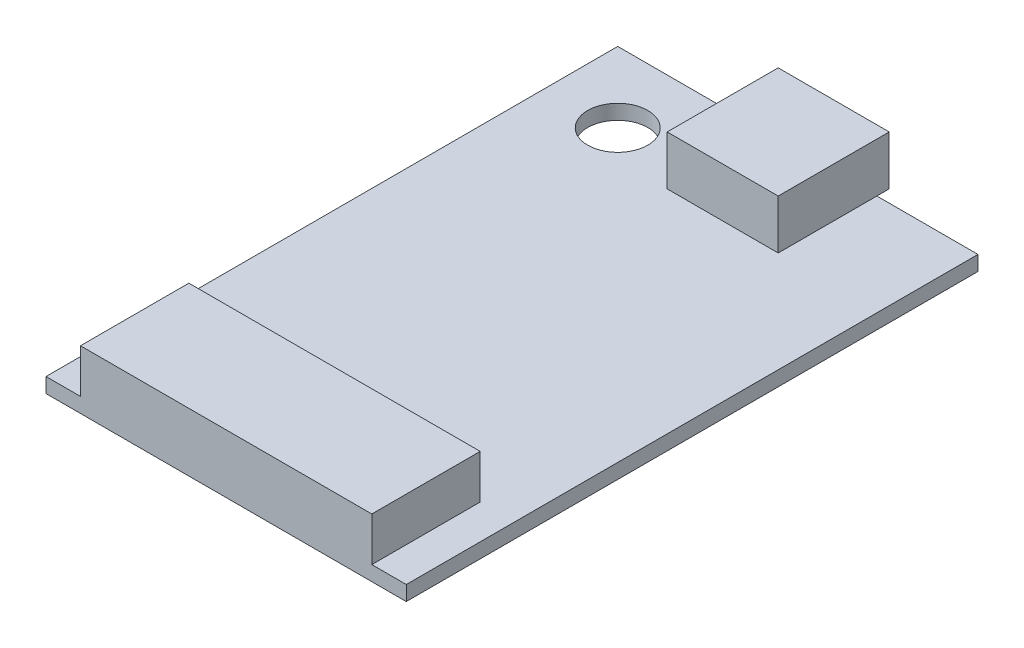
ISO-10303-21;
HEADER;
FILE_DESCRIPTION(('STEP AP214'),'2;1');
FILE_NAME('part.step','',(''),(''),'','','');
FILE_SCHEMA(('AUTOMOTIVE_DESIGN { 1 0 10303 214 1 1 1 1 }'));
ENDSEC;
DATA;
#1=APPLICATION_CONTEXT('core data for automotive mechanical design processes');
#2=APPLICATION_PROTOCOL_DEFINITION('international standard','automotive_design',2000,#1);
#3=PRODUCT_CONTEXT('',#1,'mechanical');
#4=PRODUCT('Part','Part','',(#3));
#5=PRODUCT_RELATED_PRODUCT_CATEGORY('part','',(#4));
#6=PRODUCT_DEFINITION_FORMATION('','',#4);
#7=PRODUCT_DEFINITION_CONTEXT('part definition',#1,'design');
#8=PRODUCT_DEFINITION('design','',#6,#7);
#9=PRODUCT_DEFINITION_SHAPE('','',#8);
#10=(LENGTH_UNIT() NAMED_UNIT(*) SI_UNIT(.MILLI.,.METRE.));
#11=(NAMED_UNIT(*) PLANE_ANGLE_UNIT() SI_UNIT($,.RADIAN.));
#12=(NAMED_UNIT(*) SI_UNIT($,.STERADIAN.) SOLID_ANGLE_UNIT());
#13=UNCERTAINTY_MEASURE_WITH_UNIT(LENGTH_MEASURE(1.E-05),#10,'distance_accuracy_value','');
#14=(GEOMETRIC_REPRESENTATION_CONTEXT(3) GLOBAL_UNCERTAINTY_ASSIGNED_CONTEXT((#13)) GLOBAL_UNIT_ASSIGNED_CONTEXT((#10,
#11,#12)) REPRESENTATION_CONTEXT('',''));
#15=CARTESIAN_POINT('',(0.,0.,0.));
#16=DIRECTION('',(0.,0.,1.));
#17=DIRECTION('',(1.,0.,0.));
#18=AXIS2_PLACEMENT_3D('',#15,#16,#17);
#19=CARTESIAN_POINT('',(0.,0.6,0.));
#20=DIRECTION('',(0.,-1.,0.));
#21=DIRECTION('',(0.,0.,-1.));
#22=AXIS2_PLACEMENT_3D('',#19,#20,#21);
#23=PLANE('',#22);
#24=CARTESIAN_POINT('',(-4.445,0.6,-8.73125));
#25=DIRECTION('',(0.,1.,0.));
#26=DIRECTION('',(0.,0.,1.));
#27=AXIS2_PLACEMENT_3D('',#24,#25,#26);
#28=CIRCLE('',#27,1.2192);
#29=CARTESIAN_POINT('',(-4.445,0.6,-7.51205));
#30=VERTEX_POINT('',#29);
#31=EDGE_CURVE('E252',#30,#30,#28,.T.);
#32=ORIENTED_EDGE('',*,*,#31,.F.);
#33=EDGE_LOOP('',(#32));
#34=FACE_BOUND('',#33,.T.);
#35=DIRECTION('',(0.,0.,1.));
#36=VECTOR('',#35,1.);
#37=CARTESIAN_POINT('',(-1.2975,0.6,-7.58875));
#38=LINE('',#37,#36);
#39=CARTESIAN_POINT('',(-1.2975,0.6,-11.58875));
#40=VERTEX_POINT('',#39);
#41=CARTESIAN_POINT('',(-1.2975,0.6,-7.58875));
#42=VERTEX_POINT('',#41);
#43=EDGE_CURVE('E154',#40,#42,#38,.T.);
#44=ORIENTED_EDGE('',*,*,#43,.F.);
#45=DIRECTION('',(-1.,0.,0.));
#46=VECTOR('',#45,1.);
#47=CARTESIAN_POINT('',(-7.3025,0.6,-11.58875));
#48=LINE('',#47,#46);
#49=CARTESIAN_POINT('',(-7.3025,0.6,-11.58875));
#50=VERTEX_POINT('',#49);
#51=EDGE_CURVE('E247',#40,#50,#48,.T.);
#52=ORIENTED_EDGE('',*,*,#51,.T.);
#53=DIRECTION('',(0.,0.,1.));
#54=VECTOR('',#53,1.);
#55=CARTESIAN_POINT('',(-7.3025,0.6,11.58875));
#56=LINE('',#55,#54);
#57=CARTESIAN_POINT('',(-7.3025,0.6,11.58875));
#58=VERTEX_POINT('',#57);
#59=EDGE_CURVE('E205',#50,#58,#56,.T.);
#60=ORIENTED_EDGE('',*,*,#59,.T.);
#61=DIRECTION('',(1.,0.,0.));
#62=VECTOR('',#61,1.);
#63=CARTESIAN_POINT('',(-7.3025,0.6,11.58875));
#64=LINE('',#63,#62);
#65=CARTESIAN_POINT('',(-5.9055,0.6,11.58875));
#66=VERTEX_POINT('',#65);
#67=EDGE_CURVE('E204',#58,#66,#64,.T.);
#68=ORIENTED_EDGE('',*,*,#67,.T.);
#69=DIRECTION('',(0.,0.,1.));
#70=VECTOR('',#69,1.);
#71=CARTESIAN_POINT('',(-5.9055,0.6,7.19455));
#72=LINE('',#71,#70);
#73=CARTESIAN_POINT('',(-5.9055,0.6,7.19455));
#74=VERTEX_POINT('',#73);
#75=EDGE_CURVE('E168',#74,#66,#72,.T.);
#76=ORIENTED_EDGE('',*,*,#75,.F.);
#77=DIRECTION('',(-1.,0.,0.));
#78=VECTOR('',#77,1.);
#79=CARTESIAN_POINT('',(-5.9055,0.6,7.19455));
#80=LINE('',#79,#78);
#81=CARTESIAN_POINT('',(5.9055,0.6,7.19455));
#82=VERTEX_POINT('',#81);
#83=EDGE_CURVE('E158',#82,#74,#80,.T.);
#84=ORIENTED_EDGE('',*,*,#83,.F.);
#85=DIRECTION('',(0.,0.,-1.));
#86=VECTOR('',#85,1.);
#87=CARTESIAN_POINT('',(5.9055,0.6,7.19455));
#88=LINE('',#87,#86);
#89=CARTESIAN_POINT('',(5.90549999999999,0.6,11.58875));
#90=VERTEX_POINT('',#89);
#91=EDGE_CURVE('E155',#90,#82,#88,.T.);
#92=ORIENTED_EDGE('',*,*,#91,.F.);
#93=CARTESIAN_POINT('',(7.3025,0.6,11.58875));
#94=VERTEX_POINT('',#93);
#95=EDGE_CURVE('E201',#90,#94,#64,.T.);
#96=ORIENTED_EDGE('',*,*,#95,.T.);
#97=DIRECTION('',(0.,0.,-1.));
#98=VECTOR('',#97,1.);
#99=CARTESIAN_POINT('',(7.3025,0.6,11.58875));
#100=LINE('',#99,#98);
#101=CARTESIAN_POINT('',(7.3025,0.6,-11.58875));
#102=VERTEX_POINT('',#101);
#103=EDGE_CURVE('E221',#94,#102,#100,.T.);
#104=ORIENTED_EDGE('',*,*,#103,.T.);
#105=CARTESIAN_POINT('',(3.2025,0.6,-11.58875));
#106=VERTEX_POINT('',#105);
#107=EDGE_CURVE('E250',#102,#106,#48,.T.);
#108=ORIENTED_EDGE('',*,*,#107,.T.);
#109=DIRECTION('',(0.,0.,-1.));
#110=VECTOR('',#109,1.);
#111=CARTESIAN_POINT('',(3.2025,0.6,-7.58875));
#112=LINE('',#111,#110);
#113=CARTESIAN_POINT('',(3.2025,0.6,-7.58875));
#114=VERTEX_POINT('',#113);
#115=EDGE_CURVE('E56',#114,#106,#112,.T.);
#116=ORIENTED_EDGE('',*,*,#115,.F.);
#117=DIRECTION('',(1.,0.,0.));
#118=VECTOR('',#117,1.);
#119=CARTESIAN_POINT('',(3.2025,0.6,-7.58875));
#120=LINE('',#119,#118);
#121=EDGE_CURVE('E51',#42,#114,#120,.T.);
#122=ORIENTED_EDGE('',*,*,#121,.F.);
#123=EDGE_LOOP('',(#44,#52,#60,#68,#76,#84,#92,#96,#104,#108,#116,#122));
#124=FACE_BOUND('',#123,.T.);
#125=ADVANCED_FACE('F34',(#34,#124),#23,.F.);
#126=CARTESIAN_POINT('',(7.3025,0.6,11.58875));
#127=DIRECTION('',(-1.,0.,0.));
#128=DIRECTION('',(0.,0.,1.));
#129=AXIS2_PLACEMENT_3D('',#126,#127,#128);
#130=PLANE('',#129);
#131=DIRECTION('',(0.,0.,-1.));
#132=VECTOR('',#131,1.);
#133=CARTESIAN_POINT('',(7.3025,0.,11.58875));
#134=LINE('',#133,#132);
#135=CARTESIAN_POINT('',(7.3025,0.,11.58875));
#136=VERTEX_POINT('',#135);
#137=CARTESIAN_POINT('',(7.3025,0.,-11.58875));
#138=VERTEX_POINT('',#137);
#139=EDGE_CURVE('E210',#136,#138,#134,.T.);
#140=ORIENTED_EDGE('',*,*,#139,.T.);
#141=DIRECTION('',(0.,-1.,0.));
#142=VECTOR('',#141,1.);
#143=CARTESIAN_POINT('',(7.3025,0.6,-11.58875));
#144=LINE('',#143,#142);
#145=EDGE_CURVE('E11',#102,#138,#144,.T.);
#146=ORIENTED_EDGE('',*,*,#145,.F.);
#147=ORIENTED_EDGE('',*,*,#103,.F.);
#148=DIRECTION('',(0.,-1.,0.));
#149=VECTOR('',#148,1.);
#150=CARTESIAN_POINT('',(7.3025,0.6,11.58875));
#151=LINE('',#150,#149);
#152=EDGE_CURVE('E222',#94,#136,#151,.T.);
#153=ORIENTED_EDGE('',*,*,#152,.T.);
#154=EDGE_LOOP('',(#140,#146,#147,#153));
#155=FACE_BOUND('',#154,.T.);
#156=ADVANCED_FACE('F36',(#155),#130,.F.);
#157=CARTESIAN_POINT('',(-7.3025,0.6,-11.58875));
#158=DIRECTION('',(0.,0.,1.));
#159=DIRECTION('',(1.,0.,0.));
#160=AXIS2_PLACEMENT_3D('',#157,#158,#159);
#161=PLANE('',#160);
#162=DIRECTION('',(-1.,0.,0.));
#163=VECTOR('',#162,1.);
#164=CARTESIAN_POINT('',(-7.3025,0.,-11.58875));
#165=LINE('',#164,#163);
#166=CARTESIAN_POINT('',(-7.3025,0.,-11.58875));
#167=VERTEX_POINT('',#166);
#168=EDGE_CURVE('E214',#138,#167,#165,.T.);
#169=ORIENTED_EDGE('',*,*,#168,.T.);
#170=DIRECTION('',(0.,-1.,0.));
#171=VECTOR('',#170,1.);
#172=CARTESIAN_POINT('',(-7.3025,0.6,-11.58875));
#173=LINE('',#172,#171);
#174=EDGE_CURVE('E43',#50,#167,#173,.T.);
#175=ORIENTED_EDGE('',*,*,#174,.F.);
#176=ORIENTED_EDGE('',*,*,#51,.F.);
#177=EDGE_CURVE('E249',#106,#40,#48,.T.);
#178=ORIENTED_EDGE('',*,*,#177,.F.);
#179=ORIENTED_EDGE('',*,*,#107,.F.);
#180=ORIENTED_EDGE('',*,*,#145,.T.);
#181=EDGE_LOOP('',(#169,#175,#176,#178,#179,#180));
#182=FACE_BOUND('',#181,.T.);
#183=ADVANCED_FACE('F290',(#182),#161,.F.);
#184=CARTESIAN_POINT('',(-7.3025,0.6,11.58875));
#185=DIRECTION('',(1.,0.,0.));
#186=DIRECTION('',(0.,0.,-1.));
#187=AXIS2_PLACEMENT_3D('',#184,#185,#186);
#188=PLANE('',#187);
#189=DIRECTION('',(0.,0.,1.));
#190=VECTOR('',#189,1.);
#191=CARTESIAN_POINT('',(-7.3025,0.,11.58875));
#192=LINE('',#191,#190);
#193=CARTESIAN_POINT('',(-7.3025,0.,11.58875));
#194=VERTEX_POINT('',#193);
#195=EDGE_CURVE('E217',#167,#194,#192,.T.);
#196=ORIENTED_EDGE('',*,*,#195,.T.);
#197=DIRECTION('',(0.,-1.,0.));
#198=VECTOR('',#197,1.);
#199=CARTESIAN_POINT('',(-7.3025,0.6,11.58875));
#200=LINE('',#199,#198);
#201=EDGE_CURVE('E225',#58,#194,#200,.T.);
#202=ORIENTED_EDGE('',*,*,#201,.F.);
#203=ORIENTED_EDGE('',*,*,#59,.F.);
#204=ORIENTED_EDGE('',*,*,#174,.T.);
#205=EDGE_LOOP('',(#196,#202,#203,#204));
#206=FACE_BOUND('',#205,.T.);
#207=ADVANCED_FACE('F233',(#206),#188,.F.);
#208=CARTESIAN_POINT('',(-7.3025,0.6,11.58875));
#209=DIRECTION('',(0.,0.,-1.));
#210=DIRECTION('',(-1.,0.,0.));
#211=AXIS2_PLACEMENT_3D('',#208,#209,#210);
#212=PLANE('',#211);
#213=DIRECTION('',(1.,0.,0.));
#214=VECTOR('',#213,1.);
#215=CARTESIAN_POINT('',(-7.3025,0.,11.58875));
#216=LINE('',#215,#214);
#217=EDGE_CURVE('E219',#194,#136,#216,.T.);
#218=ORIENTED_EDGE('',*,*,#217,.T.);
#219=ORIENTED_EDGE('',*,*,#152,.F.);
#220=ORIENTED_EDGE('',*,*,#95,.F.);
#221=DIRECTION('',(0.,-1.,0.));
#222=VECTOR('',#221,1.);
#223=CARTESIAN_POINT('',(5.9055,2.378,11.58875));
#224=LINE('',#223,#222);
#225=CARTESIAN_POINT('',(5.9055,2.378,11.58875));
#226=VERTEX_POINT('',#225);
#227=EDGE_CURVE('E174',#226,#90,#224,.T.);
#228=ORIENTED_EDGE('',*,*,#227,.F.);
#229=DIRECTION('',(1.,0.,0.));
#230=VECTOR('',#229,1.);
#231=CARTESIAN_POINT('',(-5.9055,2.378,11.58875));
#232=LINE('',#231,#230);
#233=CARTESIAN_POINT('',(-5.9055,2.378,11.58875));
#234=VERTEX_POINT('',#233);
#235=EDGE_CURVE('E172',#234,#226,#232,.T.);
#236=ORIENTED_EDGE('',*,*,#235,.F.);
#237=DIRECTION('',(0.,-1.,0.));
#238=VECTOR('',#237,1.);
#239=CARTESIAN_POINT('',(-5.9055,2.378,11.58875));
#240=LINE('',#239,#238);
#241=EDGE_CURVE('E186',#234,#66,#240,.T.);
#242=ORIENTED_EDGE('',*,*,#241,.T.);
#243=ORIENTED_EDGE('',*,*,#67,.F.);
#244=ORIENTED_EDGE('',*,*,#201,.T.);
#245=EDGE_LOOP('',(#218,#219,#220,#228,#236,#242,#243,#244));
#246=FACE_BOUND('',#245,.T.);
#247=ADVANCED_FACE('F241',(#246),#212,.F.);
#248=CARTESIAN_POINT('',(0.,0.,0.));
#249=DIRECTION('',(0.,-1.,0.));
#250=DIRECTION('',(0.,0.,-1.));
#251=AXIS2_PLACEMENT_3D('',#248,#249,#250);
#252=PLANE('',#251);
#253=CARTESIAN_POINT('',(-4.445,0.,-8.73125));
#254=DIRECTION('',(0.,1.,0.));
#255=DIRECTION('',(0.,0.,1.));
#256=AXIS2_PLACEMENT_3D('',#253,#254,#255);
#257=CIRCLE('',#256,1.2192);
#258=CARTESIAN_POINT('',(-4.445,0.,-7.51205));
#259=VERTEX_POINT('',#258);
#260=EDGE_CURVE('E215',#259,#259,#257,.T.);
#261=ORIENTED_EDGE('',*,*,#260,.T.);
#262=EDGE_LOOP('',(#261));
#263=FACE_BOUND('',#262,.T.);
#264=ORIENTED_EDGE('',*,*,#139,.F.);
#265=ORIENTED_EDGE('',*,*,#217,.F.);
#266=ORIENTED_EDGE('',*,*,#195,.F.);
#267=ORIENTED_EDGE('',*,*,#168,.F.);
#268=EDGE_LOOP('',(#264,#265,#266,#267));
#269=FACE_BOUND('',#268,.T.);
#270=ADVANCED_FACE('F239',(#263,#269),#252,.T.);
#271=CARTESIAN_POINT('',(-4.445,0.,-8.73125));
#272=DIRECTION('',(0.,1.,0.));
#273=DIRECTION('',(0.,0.,1.));
#274=AXIS2_PLACEMENT_3D('',#271,#272,#273);
#275=CYLINDRICAL_SURFACE('',#274,1.2192);
#276=ORIENTED_EDGE('',*,*,#260,.F.);
#277=EDGE_LOOP('',(#276));
#278=FACE_BOUND('',#277,.T.);
#279=ORIENTED_EDGE('',*,*,#31,.T.);
#280=EDGE_LOOP('',(#279));
#281=FACE_BOUND('',#280,.T.);
#282=ADVANCED_FACE('F294',(#278,#281),#275,.F.);
#283=CARTESIAN_POINT('',(5.9055,2.378,7.19455));
#284=DIRECTION('',(-1.,0.,0.));
#285=DIRECTION('',(0.,0.,1.));
#286=AXIS2_PLACEMENT_3D('',#283,#284,#285);
#287=PLANE('',#286);
#288=ORIENTED_EDGE('',*,*,#91,.T.);
#289=DIRECTION('',(0.,-1.,0.));
#290=VECTOR('',#289,1.);
#291=CARTESIAN_POINT('',(5.9055,2.378,7.19455));
#292=LINE('',#291,#290);
#293=CARTESIAN_POINT('',(5.9055,2.378,7.19455));
#294=VERTEX_POINT('',#293);
#295=EDGE_CURVE('E193',#294,#82,#292,.T.);
#296=ORIENTED_EDGE('',*,*,#295,.F.);
#297=DIRECTION('',(0.,0.,-1.));
#298=VECTOR('',#297,1.);
#299=CARTESIAN_POINT('',(5.9055,2.378,7.19455));
#300=LINE('',#299,#298);
#301=EDGE_CURVE('E164',#226,#294,#300,.T.);
#302=ORIENTED_EDGE('',*,*,#301,.F.);
#303=ORIENTED_EDGE('',*,*,#227,.T.);
#304=EDGE_LOOP('',(#288,#296,#302,#303));
#305=FACE_BOUND('',#304,.T.);
#306=ADVANCED_FACE('F327',(#305),#287,.F.);
#307=CARTESIAN_POINT('',(-5.9055,2.378,7.19455));
#308=DIRECTION('',(0.,0.,1.));
#309=DIRECTION('',(1.,0.,0.));
#310=AXIS2_PLACEMENT_3D('',#307,#308,#309);
#311=PLANE('',#310);
#312=ORIENTED_EDGE('',*,*,#83,.T.);
#313=DIRECTION('',(0.,-1.,0.));
#314=VECTOR('',#313,1.);
#315=CARTESIAN_POINT('',(-5.9055,2.378,7.19455));
#316=LINE('',#315,#314);
#317=CARTESIAN_POINT('',(-5.9055,2.378,7.19455));
#318=VERTEX_POINT('',#317);
#319=EDGE_CURVE('E179',#318,#74,#316,.T.);
#320=ORIENTED_EDGE('',*,*,#319,.F.);
#321=DIRECTION('',(-1.,0.,0.));
#322=VECTOR('',#321,1.);
#323=CARTESIAN_POINT('',(-5.9055,2.378,7.19455));
#324=LINE('',#323,#322);
#325=EDGE_CURVE('E167',#294,#318,#324,.T.);
#326=ORIENTED_EDGE('',*,*,#325,.F.);
#327=ORIENTED_EDGE('',*,*,#295,.T.);
#328=EDGE_LOOP('',(#312,#320,#326,#327));
#329=FACE_BOUND('',#328,.T.);
#330=ADVANCED_FACE('F333',(#329),#311,.F.);
#331=CARTESIAN_POINT('',(-5.9055,2.378,7.19455));
#332=DIRECTION('',(1.,0.,0.));
#333=DIRECTION('',(0.,0.,-1.));
#334=AXIS2_PLACEMENT_3D('',#331,#332,#333);
#335=PLANE('',#334);
#336=ORIENTED_EDGE('',*,*,#75,.T.);
#337=ORIENTED_EDGE('',*,*,#241,.F.);
#338=DIRECTION('',(0.,0.,1.));
#339=VECTOR('',#338,1.);
#340=CARTESIAN_POINT('',(-5.9055,2.378,7.19455));
#341=LINE('',#340,#339);
#342=EDGE_CURVE('E170',#318,#234,#341,.T.);
#343=ORIENTED_EDGE('',*,*,#342,.F.);
#344=ORIENTED_EDGE('',*,*,#319,.T.);
#345=EDGE_LOOP('',(#336,#337,#343,#344));
#346=FACE_BOUND('',#345,.T.);
#347=ADVANCED_FACE('F339',(#346),#335,.F.);
#348=CARTESIAN_POINT('',(0.,2.378,0.));
#349=DIRECTION('',(0.,1.,0.));
#350=DIRECTION('',(0.,0.,1.));
#351=AXIS2_PLACEMENT_3D('',#348,#349,#350);
#352=PLANE('',#351);
#353=ORIENTED_EDGE('',*,*,#301,.T.);
#354=ORIENTED_EDGE('',*,*,#325,.T.);
#355=ORIENTED_EDGE('',*,*,#342,.T.);
#356=ORIENTED_EDGE('',*,*,#235,.T.);
#357=EDGE_LOOP('',(#353,#354,#355,#356));
#358=FACE_BOUND('',#357,.T.);
#359=ADVANCED_FACE('F347',(#358),#352,.T.);
#360=CARTESIAN_POINT('',(0.,0.6,0.));
#361=DIRECTION('',(0.,1.,0.));
#362=DIRECTION('',(0.,0.,1.));
#363=AXIS2_PLACEMENT_3D('',#360,#361,#362);
#364=PLANE('',#363);
#365=CARTESIAN_POINT('',(3.2025,0.6,-12.08875));
#366=VERTEX_POINT('',#365);
#367=EDGE_CURVE('E261',#106,#366,#112,.T.);
#368=ORIENTED_EDGE('',*,*,#367,.F.);
#369=ORIENTED_EDGE('',*,*,#177,.T.);
#370=CARTESIAN_POINT('',(-1.2975,0.6,-12.08875));
#371=VERTEX_POINT('',#370);
#372=EDGE_CURVE('E260',#371,#40,#38,.T.);
#373=ORIENTED_EDGE('',*,*,#372,.F.);
#374=DIRECTION('',(-1.,0.,0.));
#375=VECTOR('',#374,1.);
#376=CARTESIAN_POINT('',(3.2025,0.6,-12.08875));
#377=LINE('',#376,#375);
#378=EDGE_CURVE('E150',#366,#371,#377,.T.);
#379=ORIENTED_EDGE('',*,*,#378,.F.);
#380=EDGE_LOOP('',(#368,#369,#373,#379));
#381=FACE_BOUND('',#380,.T.);
#382=ADVANCED_FACE('F258',(#381),#364,.F.);
#383=CARTESIAN_POINT('',(-1.2975,2.6,-7.58875));
#384=DIRECTION('',(1.,0.,0.));
#385=DIRECTION('',(0.,0.,-1.));
#386=AXIS2_PLACEMENT_3D('',#383,#384,#385);
#387=PLANE('',#386);
#388=ORIENTED_EDGE('',*,*,#372,.T.);
#389=ORIENTED_EDGE('',*,*,#43,.T.);
#390=DIRECTION('',(0.,-1.,0.));
#391=VECTOR('',#390,1.);
#392=CARTESIAN_POINT('',(-1.2975,2.6,-7.58875));
#393=LINE('',#392,#391);
#394=CARTESIAN_POINT('',(-1.2975,2.6,-7.58875));
#395=VERTEX_POINT('',#394);
#396=EDGE_CURVE('E135',#395,#42,#393,.T.);
#397=ORIENTED_EDGE('',*,*,#396,.F.);
#398=DIRECTION('',(0.,0.,1.));
#399=VECTOR('',#398,1.);
#400=CARTESIAN_POINT('',(-1.2975,2.6,-7.58875));
#401=LINE('',#400,#399);
#402=CARTESIAN_POINT('',(-1.2975,2.6,-12.08875));
#403=VERTEX_POINT('',#402);
#404=EDGE_CURVE('E141',#403,#395,#401,.T.);
#405=ORIENTED_EDGE('',*,*,#404,.F.);
#406=DIRECTION('',(0.,-1.,0.));
#407=VECTOR('',#406,1.);
#408=CARTESIAN_POINT('',(-1.2975,2.6,-12.08875));
#409=LINE('',#408,#407);
#410=EDGE_CURVE('E262',#403,#371,#409,.T.);
#411=ORIENTED_EDGE('',*,*,#410,.T.);
#412=EDGE_LOOP('',(#388,#389,#397,#405,#411));
#413=FACE_BOUND('',#412,.T.);
#414=ADVANCED_FACE('F153',(#413),#387,.F.);
#415=CARTESIAN_POINT('',(3.2025,2.6,-7.58875));
#416=DIRECTION('',(0.,0.,-1.));
#417=DIRECTION('',(-1.,0.,0.));
#418=AXIS2_PLACEMENT_3D('',#415,#416,#417);
#419=PLANE('',#418);
#420=ORIENTED_EDGE('',*,*,#121,.T.);
#421=DIRECTION('',(0.,-1.,0.));
#422=VECTOR('',#421,1.);
#423=CARTESIAN_POINT('',(3.2025,2.6,-7.58875));
#424=LINE('',#423,#422);
#425=CARTESIAN_POINT('',(3.2025,2.6,-7.58875));
#426=VERTEX_POINT('',#425);
#427=EDGE_CURVE('E137',#426,#114,#424,.T.);
#428=ORIENTED_EDGE('',*,*,#427,.F.);
#429=DIRECTION('',(1.,0.,0.));
#430=VECTOR('',#429,1.);
#431=CARTESIAN_POINT('',(3.2025,2.6,-7.58875));
#432=LINE('',#431,#430);
#433=EDGE_CURVE('E131',#395,#426,#432,.T.);
#434=ORIENTED_EDGE('',*,*,#433,.F.);
#435=ORIENTED_EDGE('',*,*,#396,.T.);
#436=EDGE_LOOP('',(#420,#428,#434,#435));
#437=FACE_BOUND('',#436,.T.);
#438=ADVANCED_FACE('F133',(#437),#419,.F.);
#439=CARTESIAN_POINT('',(3.2025,2.6,-7.58875));
#440=DIRECTION('',(-1.,0.,0.));
#441=DIRECTION('',(0.,0.,1.));
#442=AXIS2_PLACEMENT_3D('',#439,#440,#441);
#443=PLANE('',#442);
#444=ORIENTED_EDGE('',*,*,#115,.T.);
#445=ORIENTED_EDGE('',*,*,#367,.T.);
#446=DIRECTION('',(0.,-1.,0.));
#447=VECTOR('',#446,1.);
#448=CARTESIAN_POINT('',(3.2025,2.6,-12.08875));
#449=LINE('',#448,#447);
#450=CARTESIAN_POINT('',(3.2025,2.6,-12.08875));
#451=VERTEX_POINT('',#450);
#452=EDGE_CURVE('E160',#451,#366,#449,.T.);
#453=ORIENTED_EDGE('',*,*,#452,.F.);
#454=DIRECTION('',(0.,0.,-1.));
#455=VECTOR('',#454,1.);
#456=CARTESIAN_POINT('',(3.2025,2.6,-7.58875));
#457=LINE('',#456,#455);
#458=EDGE_CURVE('E140',#426,#451,#457,.T.);
#459=ORIENTED_EDGE('',*,*,#458,.F.);
#460=ORIENTED_EDGE('',*,*,#427,.T.);
#461=EDGE_LOOP('',(#444,#445,#453,#459,#460));
#462=FACE_BOUND('',#461,.T.);
#463=ADVANCED_FACE('F275',(#462),#443,.F.);
#464=CARTESIAN_POINT('',(3.2025,2.6,-12.08875));
#465=DIRECTION('',(0.,0.,1.));
#466=DIRECTION('',(1.,0.,0.));
#467=AXIS2_PLACEMENT_3D('',#464,#465,#466);
#468=PLANE('',#467);
#469=ORIENTED_EDGE('',*,*,#378,.T.);
#470=ORIENTED_EDGE('',*,*,#410,.F.);
#471=DIRECTION('',(-1.,0.,0.));
#472=VECTOR('',#471,1.);
#473=CARTESIAN_POINT('',(3.2025,2.6,-12.08875));
#474=LINE('',#473,#472);
#475=EDGE_CURVE('E146',#451,#403,#474,.T.);
#476=ORIENTED_EDGE('',*,*,#475,.F.);
#477=ORIENTED_EDGE('',*,*,#452,.T.);
#478=EDGE_LOOP('',(#469,#470,#476,#477));
#479=FACE_BOUND('',#478,.T.);
#480=ADVANCED_FACE('F273',(#479),#468,.F.);
#481=CARTESIAN_POINT('',(0.,2.6,0.));
#482=DIRECTION('',(0.,1.,0.));
#483=DIRECTION('',(0.,0.,1.));
#484=AXIS2_PLACEMENT_3D('',#481,#482,#483);
#485=PLANE('',#484);
#486=ORIENTED_EDGE('',*,*,#404,.T.);
#487=ORIENTED_EDGE('',*,*,#433,.T.);
#488=ORIENTED_EDGE('',*,*,#458,.T.);
#489=ORIENTED_EDGE('',*,*,#475,.T.);
#490=EDGE_LOOP('',(#486,#487,#488,#489));
#491=FACE_BOUND('',#490,.T.);
#492=ADVANCED_FACE('F144',(#491),#485,.T.);
#493=CLOSED_SHELL('',(#125,#156,#183,#207,#247,#270,#282,#306,#330,#347,#359,#382,#414,#438,
#463,#480,#492));
#494=MANIFOLD_SOLID_BREP('B2',#493);
#495=ADVANCED_BREP_SHAPE_REPRESENTATION('',(#18,#494),#14);
#496=SHAPE_DEFINITION_REPRESENTATION(#9,#495);
ENDSEC;
END-ISO-10303-21;
